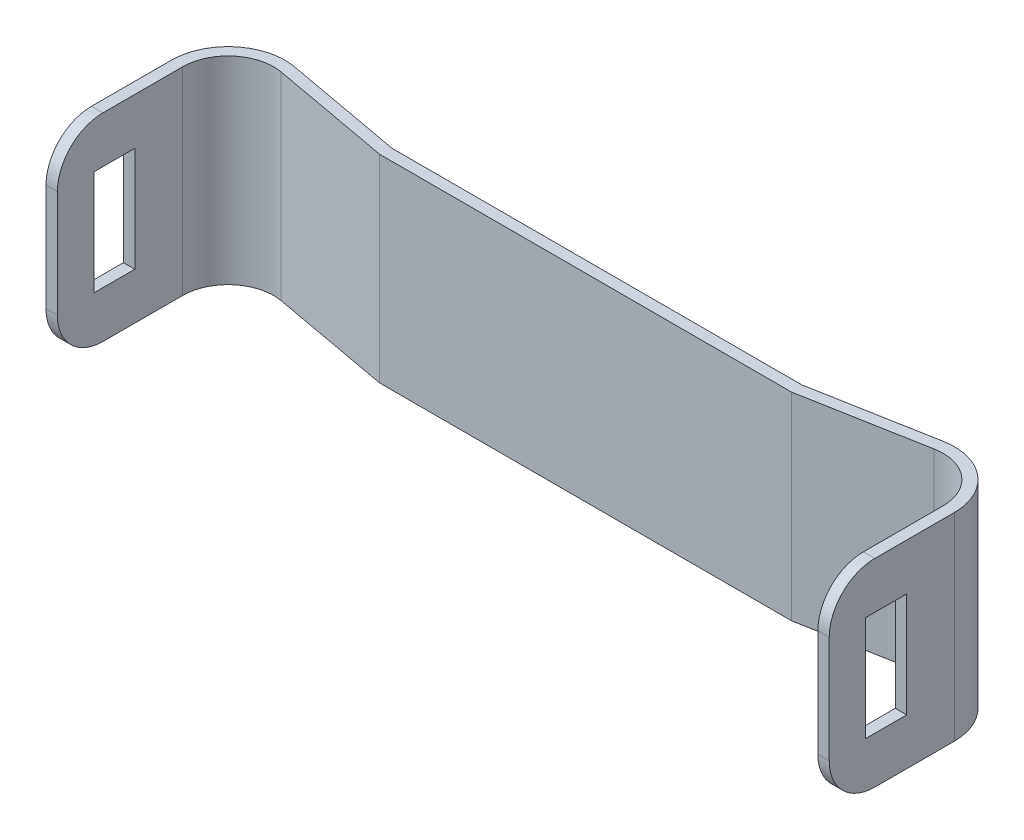
ISO-10303-21;
HEADER;
FILE_DESCRIPTION(('STEP AP214'),'2;1');
FILE_NAME('part.step','',(''),(''),'','','');
FILE_SCHEMA(('AUTOMOTIVE_DESIGN { 1 0 10303 214 1 1 1 1 }'));
ENDSEC;
DATA;
#1=APPLICATION_CONTEXT('core data for automotive mechanical design processes');
#2=APPLICATION_PROTOCOL_DEFINITION('international standard','automotive_design',2000,#1);
#3=PRODUCT_CONTEXT('',#1,'mechanical');
#4=PRODUCT('Part','Part','',(#3));
#5=PRODUCT_RELATED_PRODUCT_CATEGORY('part','',(#4));
#6=PRODUCT_DEFINITION_FORMATION('','',#4);
#7=PRODUCT_DEFINITION_CONTEXT('part definition',#1,'design');
#8=PRODUCT_DEFINITION('design','',#6,#7);
#9=PRODUCT_DEFINITION_SHAPE('','',#8);
#10=(LENGTH_UNIT() NAMED_UNIT(*) SI_UNIT(.MILLI.,.METRE.));
#11=(NAMED_UNIT(*) PLANE_ANGLE_UNIT() SI_UNIT($,.RADIAN.));
#12=(NAMED_UNIT(*) SI_UNIT($,.STERADIAN.) SOLID_ANGLE_UNIT());
#13=UNCERTAINTY_MEASURE_WITH_UNIT(LENGTH_MEASURE(1.E-05),#10,'distance_accuracy_value','');
#14=(GEOMETRIC_REPRESENTATION_CONTEXT(3) GLOBAL_UNCERTAINTY_ASSIGNED_CONTEXT((#13)) GLOBAL_UNIT_ASSIGNED_CONTEXT((#10,
#11,#12)) REPRESENTATION_CONTEXT('',''));
#15=CARTESIAN_POINT('',(0.,0.,0.));
#16=DIRECTION('',(0.,0.,1.));
#17=DIRECTION('',(1.,0.,0.));
#18=AXIS2_PLACEMENT_3D('',#15,#16,#17);
#19=CARTESIAN_POINT('',(-16.7,4.35,7.));
#20=DIRECTION('',(0.,0.,1.));
#21=DIRECTION('',(1.,0.,0.));
#22=AXIS2_PLACEMENT_3D('',#19,#20,#21);
#23=PLANE('',#22);
#24=DIRECTION('',(0.,-1.,0.));
#25=VECTOR('',#24,1.);
#26=CARTESIAN_POINT('',(-16.7,4.35,7.));
#27=LINE('',#26,#25);
#28=CARTESIAN_POINT('',(-16.7,2.35,7.));
#29=VERTEX_POINT('',#28);
#30=CARTESIAN_POINT('',(-16.7,-2.35,7.));
#31=VERTEX_POINT('',#30);
#32=EDGE_CURVE('E346',#29,#31,#27,.T.);
#33=ORIENTED_EDGE('',*,*,#32,.F.);
#34=DIRECTION('',(1.,0.,0.));
#35=VECTOR('',#34,1.);
#36=CARTESIAN_POINT('',(-17.2,2.35,7.));
#37=LINE('',#36,#35);
#38=CARTESIAN_POINT('',(-17.2,2.35,7.));
#39=VERTEX_POINT('',#38);
#40=EDGE_CURVE('E399',#39,#29,#37,.T.);
#41=ORIENTED_EDGE('',*,*,#40,.F.);
#42=DIRECTION('',(0.,-1.,0.));
#43=VECTOR('',#42,1.);
#44=CARTESIAN_POINT('',(-17.2,4.35,7.));
#45=LINE('',#44,#43);
#46=CARTESIAN_POINT('',(-17.2,-2.35,7.));
#47=VERTEX_POINT('',#46);
#48=EDGE_CURVE('E233',#39,#47,#45,.T.);
#49=ORIENTED_EDGE('',*,*,#48,.T.);
#50=DIRECTION('',(1.,0.,0.));
#51=VECTOR('',#50,1.);
#52=CARTESIAN_POINT('',(-17.2,-2.35,7.));
#53=LINE('',#52,#51);
#54=EDGE_CURVE('E569',#47,#31,#53,.T.);
#55=ORIENTED_EDGE('',*,*,#54,.T.);
#56=EDGE_LOOP('',(#33,#41,#49,#55));
#57=FACE_BOUND('',#56,.T.);
#58=ADVANCED_FACE('F33',(#57),#23,.T.);
#59=CARTESIAN_POINT('',(17.2,4.35,7.));
#60=DIRECTION('',(0.,0.,1.));
#61=DIRECTION('',(1.,0.,0.));
#62=AXIS2_PLACEMENT_3D('',#59,#60,#61);
#63=PLANE('',#62);
#64=DIRECTION('',(0.,-1.,0.));
#65=VECTOR('',#64,1.);
#66=CARTESIAN_POINT('',(17.2,4.35,7.));
#67=LINE('',#66,#65);
#68=CARTESIAN_POINT('',(17.2,2.35,7.));
#69=VERTEX_POINT('',#68);
#70=CARTESIAN_POINT('',(17.2,-2.35,7.));
#71=VERTEX_POINT('',#70);
#72=EDGE_CURVE('E327',#69,#71,#67,.T.);
#73=ORIENTED_EDGE('',*,*,#72,.F.);
#74=CARTESIAN_POINT('',(16.7,2.35,7.));
#75=VERTEX_POINT('',#74);
#76=EDGE_CURVE('E568',#75,#69,#37,.T.);
#77=ORIENTED_EDGE('',*,*,#76,.F.);
#78=DIRECTION('',(0.,-1.,0.));
#79=VECTOR('',#78,1.);
#80=CARTESIAN_POINT('',(16.7,4.35,7.));
#81=LINE('',#80,#79);
#82=CARTESIAN_POINT('',(16.7,-2.35,7.));
#83=VERTEX_POINT('',#82);
#84=EDGE_CURVE('E330',#75,#83,#81,.T.);
#85=ORIENTED_EDGE('',*,*,#84,.T.);
#86=EDGE_CURVE('E567',#83,#71,#53,.T.);
#87=ORIENTED_EDGE('',*,*,#86,.T.);
#88=EDGE_LOOP('',(#73,#77,#85,#87));
#89=FACE_BOUND('',#88,.T.);
#90=ADVANCED_FACE('F491',(#89),#63,.T.);
#91=CARTESIAN_POINT('',(-17.2,4.35,1.5));
#92=DIRECTION('',(1.,0.,0.));
#93=DIRECTION('',(0.,0.,-1.));
#94=AXIS2_PLACEMENT_3D('',#91,#92,#93);
#95=PLANE('',#94);
#96=DIRECTION('',(0.,0.,1.));
#97=VECTOR('',#96,1.);
#98=CARTESIAN_POINT('',(-17.2,2.3,5.4));
#99=LINE('',#98,#97);
#100=CARTESIAN_POINT('',(-17.2,2.3,3.6));
#101=VERTEX_POINT('',#100);
#102=CARTESIAN_POINT('',(-17.2,2.3,5.4));
#103=VERTEX_POINT('',#102);
#104=EDGE_CURVE('E414',#101,#103,#99,.T.);
#105=ORIENTED_EDGE('',*,*,#104,.T.);
#106=DIRECTION('',(0.,-1.,0.));
#107=VECTOR('',#106,1.);
#108=CARTESIAN_POINT('',(-17.2,2.3,5.4));
#109=LINE('',#108,#107);
#110=CARTESIAN_POINT('',(-17.2,-2.3,5.4));
#111=VERTEX_POINT('',#110);
#112=EDGE_CURVE('E404',#103,#111,#109,.T.);
#113=ORIENTED_EDGE('',*,*,#112,.T.);
#114=DIRECTION('',(0.,0.,-1.));
#115=VECTOR('',#114,1.);
#116=CARTESIAN_POINT('',(-17.2,-2.3,5.4));
#117=LINE('',#116,#115);
#118=CARTESIAN_POINT('',(-17.2,-2.3,3.6));
#119=VERTEX_POINT('',#118);
#120=EDGE_CURVE('E407',#111,#119,#117,.T.);
#121=ORIENTED_EDGE('',*,*,#120,.T.);
#122=DIRECTION('',(0.,1.,0.));
#123=VECTOR('',#122,1.);
#124=CARTESIAN_POINT('',(-17.2,2.3,3.6));
#125=LINE('',#124,#123);
#126=EDGE_CURVE('E411',#119,#101,#125,.T.);
#127=ORIENTED_EDGE('',*,*,#126,.T.);
#128=EDGE_LOOP('',(#105,#113,#121,#127));
#129=FACE_BOUND('',#128,.T.);
#130=ORIENTED_EDGE('',*,*,#48,.F.);
#131=CARTESIAN_POINT('',(-17.2,2.35,5.));
#132=DIRECTION('',(-1.,0.,0.));
#133=DIRECTION('',(0.,0.,1.));
#134=AXIS2_PLACEMENT_3D('',#131,#132,#133);
#135=CIRCLE('',#134,2.);
#136=CARTESIAN_POINT('',(-17.2,4.35,5.));
#137=VERTEX_POINT('',#136);
#138=EDGE_CURVE('E217',#39,#137,#135,.T.);
#139=ORIENTED_EDGE('',*,*,#138,.T.);
#140=DIRECTION('',(0.,0.,1.));
#141=VECTOR('',#140,1.);
#142=CARTESIAN_POINT('',(-17.2,4.35,1.5));
#143=LINE('',#142,#141);
#144=CARTESIAN_POINT('',(-17.2,4.35,1.5));
#145=VERTEX_POINT('',#144);
#146=EDGE_CURVE('E230',#145,#137,#143,.T.);
#147=ORIENTED_EDGE('',*,*,#146,.F.);
#148=DIRECTION('',(0.,-1.,0.));
#149=VECTOR('',#148,1.);
#150=CARTESIAN_POINT('',(-17.2,4.35,1.5));
#151=LINE('',#150,#149);
#152=CARTESIAN_POINT('',(-17.2,-4.35,1.5));
#153=VERTEX_POINT('',#152);
#154=EDGE_CURVE('E278',#145,#153,#151,.T.);
#155=ORIENTED_EDGE('',*,*,#154,.T.);
#156=DIRECTION('',(0.,0.,1.));
#157=VECTOR('',#156,1.);
#158=CARTESIAN_POINT('',(-17.2,-4.35,1.5));
#159=LINE('',#158,#157);
#160=CARTESIAN_POINT('',(-17.2,-4.35,5.));
#161=VERTEX_POINT('',#160);
#162=EDGE_CURVE('E279',#153,#161,#159,.T.);
#163=ORIENTED_EDGE('',*,*,#162,.T.);
#164=CARTESIAN_POINT('',(-17.2,-2.35,5.));
#165=DIRECTION('',(-1.,0.,0.));
#166=DIRECTION('',(0.,0.,-1.));
#167=AXIS2_PLACEMENT_3D('',#164,#165,#166);
#168=CIRCLE('',#167,2.);
#169=EDGE_CURVE('E224',#161,#47,#168,.T.);
#170=ORIENTED_EDGE('',*,*,#169,.T.);
#171=EDGE_LOOP('',(#130,#139,#147,#155,#163,#170));
#172=FACE_BOUND('',#171,.T.);
#173=ADVANCED_FACE('F35',(#129,#172),#95,.F.);
#174=CARTESIAN_POINT('',(-16.7,4.35,1.5));
#175=DIRECTION('',(1.,0.,0.));
#176=DIRECTION('',(0.,0.,-1.));
#177=AXIS2_PLACEMENT_3D('',#174,#175,#176);
#178=PLANE('',#177);
#179=CARTESIAN_POINT('',(-16.7,2.35,5.));
#180=DIRECTION('',(1.,0.,0.));
#181=DIRECTION('',(0.,0.,-1.));
#182=AXIS2_PLACEMENT_3D('',#179,#180,#181);
#183=CIRCLE('',#182,2.);
#184=CARTESIAN_POINT('',(-16.7,4.35,5.));
#185=VERTEX_POINT('',#184);
#186=EDGE_CURVE('E55',#29,#185,#183,.F.);
#187=ORIENTED_EDGE('',*,*,#186,.F.);
#188=ORIENTED_EDGE('',*,*,#32,.T.);
#189=CARTESIAN_POINT('',(-16.7,-2.35,5.));
#190=DIRECTION('',(1.,0.,0.));
#191=DIRECTION('',(0.,0.,-1.));
#192=AXIS2_PLACEMENT_3D('',#189,#190,#191);
#193=CIRCLE('',#192,2.);
#194=CARTESIAN_POINT('',(-16.7,-4.35,5.));
#195=VERTEX_POINT('',#194);
#196=EDGE_CURVE('E392',#195,#31,#193,.F.);
#197=ORIENTED_EDGE('',*,*,#196,.F.);
#198=DIRECTION('',(0.,0.,1.));
#199=VECTOR('',#198,1.);
#200=CARTESIAN_POINT('',(-16.7,-4.35,1.5));
#201=LINE('',#200,#199);
#202=CARTESIAN_POINT('',(-16.7,-4.35,1.5));
#203=VERTEX_POINT('',#202);
#204=EDGE_CURVE('E282',#203,#195,#201,.T.);
#205=ORIENTED_EDGE('',*,*,#204,.F.);
#206=DIRECTION('',(0.,-1.,0.));
#207=VECTOR('',#206,1.);
#208=CARTESIAN_POINT('',(-16.7,4.35,1.5));
#209=LINE('',#208,#207);
#210=CARTESIAN_POINT('',(-16.7,4.35,1.5));
#211=VERTEX_POINT('',#210);
#212=EDGE_CURVE('E344',#211,#203,#209,.T.);
#213=ORIENTED_EDGE('',*,*,#212,.F.);
#214=DIRECTION('',(0.,0.,1.));
#215=VECTOR('',#214,1.);
#216=CARTESIAN_POINT('',(-16.7,4.35,1.5));
#217=LINE('',#216,#215);
#218=EDGE_CURVE('E240',#211,#185,#217,.T.);
#219=ORIENTED_EDGE('',*,*,#218,.T.);
#220=EDGE_LOOP('',(#187,#188,#197,#205,#213,#219));
#221=FACE_BOUND('',#220,.T.);
#222=DIRECTION('',(0.,-1.,0.));
#223=VECTOR('',#222,1.);
#224=CARTESIAN_POINT('',(-16.7,4.35,5.4));
#225=LINE('',#224,#223);
#226=CARTESIAN_POINT('',(-16.7,2.3,5.4));
#227=VERTEX_POINT('',#226);
#228=CARTESIAN_POINT('',(-16.7,-2.3,5.4));
#229=VERTEX_POINT('',#228);
#230=EDGE_CURVE('E248',#227,#229,#225,.T.);
#231=ORIENTED_EDGE('',*,*,#230,.F.);
#232=DIRECTION('',(0.,0.,1.));
#233=VECTOR('',#232,1.);
#234=CARTESIAN_POINT('',(-16.7,2.3,1.5));
#235=LINE('',#234,#233);
#236=CARTESIAN_POINT('',(-16.7,2.3,3.6));
#237=VERTEX_POINT('',#236);
#238=EDGE_CURVE('E452',#237,#227,#235,.T.);
#239=ORIENTED_EDGE('',*,*,#238,.F.);
#240=DIRECTION('',(0.,1.,0.));
#241=VECTOR('',#240,1.);
#242=CARTESIAN_POINT('',(-16.7,4.35,3.6));
#243=LINE('',#242,#241);
#244=CARTESIAN_POINT('',(-16.7,-2.3,3.6));
#245=VERTEX_POINT('',#244);
#246=EDGE_CURVE('E448',#245,#237,#243,.T.);
#247=ORIENTED_EDGE('',*,*,#246,.F.);
#248=DIRECTION('',(0.,0.,-1.));
#249=VECTOR('',#248,1.);
#250=CARTESIAN_POINT('',(-16.7,-2.3,1.5));
#251=LINE('',#250,#249);
#252=EDGE_CURVE('E443',#229,#245,#251,.T.);
#253=ORIENTED_EDGE('',*,*,#252,.F.);
#254=EDGE_LOOP('',(#231,#239,#247,#253));
#255=FACE_BOUND('',#254,.T.);
#256=ADVANCED_FACE('F390',(#221,#255),#178,.T.);
#257=CARTESIAN_POINT('',(-14.7,4.35,1.5));
#258=DIRECTION('',(0.,-1.,0.));
#259=DIRECTION('',(0.,0.,-1.));
#260=AXIS2_PLACEMENT_3D('',#257,#258,#259);
#261=CYLINDRICAL_SURFACE('',#260,2.);
#262=CARTESIAN_POINT('',(-14.7,-4.35,1.5));
#263=DIRECTION('',(0.,1.,0.));
#264=DIRECTION('',(1.,0.,0.));
#265=AXIS2_PLACEMENT_3D('',#262,#263,#264);
#266=CIRCLE('',#265,2.);
#267=CARTESIAN_POINT('',(-14.3405528892947,-4.35,-0.46743431265332));
#268=VERTEX_POINT('',#267);
#269=EDGE_CURVE('E285',#268,#203,#266,.T.);
#270=ORIENTED_EDGE('',*,*,#269,.F.);
#271=DIRECTION('',(0.,-1.,0.));
#272=VECTOR('',#271,1.);
#273=CARTESIAN_POINT('',(-14.3405528892947,4.35,-0.46743431265332));
#274=LINE('',#273,#272);
#275=CARTESIAN_POINT('',(-14.3405528892947,4.35,-0.46743431265332));
#276=VERTEX_POINT('',#275);
#277=EDGE_CURVE('E342',#276,#268,#274,.T.);
#278=ORIENTED_EDGE('',*,*,#277,.F.);
#279=CARTESIAN_POINT('',(-14.7,4.35,1.5));
#280=DIRECTION('',(0.,1.,0.));
#281=DIRECTION('',(1.,0.,0.));
#282=AXIS2_PLACEMENT_3D('',#279,#280,#281);
#283=CIRCLE('',#282,2.);
#284=EDGE_CURVE('E243',#276,#211,#283,.T.);
#285=ORIENTED_EDGE('',*,*,#284,.T.);
#286=ORIENTED_EDGE('',*,*,#212,.T.);
#287=EDGE_LOOP('',(#270,#278,#285,#286));
#288=FACE_BOUND('',#287,.T.);
#289=ADVANCED_FACE('F386',(#288),#261,.F.);
#290=CARTESIAN_POINT('',(-9.08986177767631,4.35,0.49185857816333));
#291=DIRECTION('',(-0.179723555352633,0.,0.983717156326659));
#292=DIRECTION('',(0.983717156326659,0.,0.179723555352634));
#293=AXIS2_PLACEMENT_3D('',#290,#291,#292);
#294=PLANE('',#293);
#295=DIRECTION('',(-0.983717156326659,0.,-0.179723555352634));
#296=VECTOR('',#295,1.);
#297=CARTESIAN_POINT('',(-9.08986177767631,-4.35,0.49185857816333));
#298=LINE('',#297,#296);
#299=CARTESIAN_POINT('',(-9.04529969274587,-4.35,0.5));
#300=VERTEX_POINT('',#299);
#301=EDGE_CURVE('E288',#300,#268,#298,.T.);
#302=ORIENTED_EDGE('',*,*,#301,.F.);
#303=DIRECTION('',(0.,-1.,0.));
#304=VECTOR('',#303,1.);
#305=CARTESIAN_POINT('',(-9.04529969274587,4.35,0.5));
#306=LINE('',#305,#304);
#307=CARTESIAN_POINT('',(-9.04529969274587,4.35,0.5));
#308=VERTEX_POINT('',#307);
#309=EDGE_CURVE('E340',#308,#300,#306,.T.);
#310=ORIENTED_EDGE('',*,*,#309,.F.);
#311=DIRECTION('',(-0.983717156326659,0.,-0.179723555352634));
#312=VECTOR('',#311,1.);
#313=CARTESIAN_POINT('',(-9.08986177767631,4.35,0.49185857816333));
#314=LINE('',#313,#312);
#315=EDGE_CURVE('E253',#308,#276,#314,.T.);
#316=ORIENTED_EDGE('',*,*,#315,.T.);
#317=ORIENTED_EDGE('',*,*,#277,.T.);
#318=EDGE_LOOP('',(#302,#310,#316,#317));
#319=FACE_BOUND('',#318,.T.);
#320=ADVANCED_FACE('F381',(#319),#294,.T.);
#321=CARTESIAN_POINT('',(-9.,4.35,0.5));
#322=DIRECTION('',(0.,0.,1.));
#323=DIRECTION('',(1.,0.,0.));
#324=AXIS2_PLACEMENT_3D('',#321,#322,#323);
#325=PLANE('',#324);
#326=DIRECTION('',(-1.,0.,0.));
#327=VECTOR('',#326,1.);
#328=CARTESIAN_POINT('',(-9.,-4.35,0.5));
#329=LINE('',#328,#327);
#330=CARTESIAN_POINT('',(9.04529969274587,-4.35,0.499999999999998));
#331=VERTEX_POINT('',#330);
#332=EDGE_CURVE('E291',#331,#300,#329,.T.);
#333=ORIENTED_EDGE('',*,*,#332,.F.);
#334=DIRECTION('',(0.,-1.,0.));
#335=VECTOR('',#334,1.);
#336=CARTESIAN_POINT('',(9.04529969274587,4.35,0.499999999999998));
#337=LINE('',#336,#335);
#338=CARTESIAN_POINT('',(9.04529969274587,4.35,0.499999999999998));
#339=VERTEX_POINT('',#338);
#340=EDGE_CURVE('E338',#339,#331,#337,.T.);
#341=ORIENTED_EDGE('',*,*,#340,.F.);
#342=DIRECTION('',(-1.,0.,0.));
#343=VECTOR('',#342,1.);
#344=CARTESIAN_POINT('',(-9.,4.35,0.5));
#345=LINE('',#344,#343);
#346=EDGE_CURVE('E256',#339,#308,#345,.T.);
#347=ORIENTED_EDGE('',*,*,#346,.T.);
#348=ORIENTED_EDGE('',*,*,#309,.T.);
#349=EDGE_LOOP('',(#333,#341,#347,#348));
#350=FACE_BOUND('',#349,.T.);
#351=ADVANCED_FACE('F377',(#350),#325,.T.);
#352=CARTESIAN_POINT('',(9.08986177767632,4.35,0.491858578163328));
#353=DIRECTION('',(0.179723555352634,0.,0.983717156326659));
#354=DIRECTION('',(0.983717156326659,0.,-0.179723555352634));
#355=AXIS2_PLACEMENT_3D('',#352,#353,#354);
#356=PLANE('',#355);
#357=DIRECTION('',(-0.983717156326659,0.,0.179723555352634));
#358=VECTOR('',#357,1.);
#359=CARTESIAN_POINT('',(9.08986177767632,-4.35,0.491858578163328));
#360=LINE('',#359,#358);
#361=CARTESIAN_POINT('',(14.3405528892947,-4.35,-0.467434312653321));
#362=VERTEX_POINT('',#361);
#363=EDGE_CURVE('E294',#362,#331,#360,.T.);
#364=ORIENTED_EDGE('',*,*,#363,.F.);
#365=DIRECTION('',(0.,-1.,0.));
#366=VECTOR('',#365,1.);
#367=CARTESIAN_POINT('',(14.3405528892947,4.35,-0.467434312653321));
#368=LINE('',#367,#366);
#369=CARTESIAN_POINT('',(14.3405528892947,4.35,-0.467434312653321));
#370=VERTEX_POINT('',#369);
#371=EDGE_CURVE('E336',#370,#362,#368,.T.);
#372=ORIENTED_EDGE('',*,*,#371,.F.);
#373=DIRECTION('',(-0.983717156326659,0.,0.179723555352634));
#374=VECTOR('',#373,1.);
#375=CARTESIAN_POINT('',(9.08986177767632,4.35,0.491858578163328));
#376=LINE('',#375,#374);
#377=EDGE_CURVE('E259',#370,#339,#376,.T.);
#378=ORIENTED_EDGE('',*,*,#377,.T.);
#379=ORIENTED_EDGE('',*,*,#340,.T.);
#380=EDGE_LOOP('',(#364,#372,#378,#379));
#381=FACE_BOUND('',#380,.T.);
#382=ADVANCED_FACE('F373',(#381),#356,.T.);
#383=CARTESIAN_POINT('',(14.7,4.35,1.5));
#384=DIRECTION('',(0.,-1.,0.));
#385=DIRECTION('',(0.,0.,-1.));
#386=AXIS2_PLACEMENT_3D('',#383,#384,#385);
#387=CYLINDRICAL_SURFACE('',#386,2.);
#388=CARTESIAN_POINT('',(14.7,-4.35,1.5));
#389=DIRECTION('',(0.,1.,0.));
#390=DIRECTION('',(1.,0.,0.));
#391=AXIS2_PLACEMENT_3D('',#388,#389,#390);
#392=CIRCLE('',#391,2.);
#393=CARTESIAN_POINT('',(16.7,-4.35,1.5));
#394=VERTEX_POINT('',#393);
#395=EDGE_CURVE('E297',#394,#362,#392,.T.);
#396=ORIENTED_EDGE('',*,*,#395,.F.);
#397=DIRECTION('',(0.,-1.,0.));
#398=VECTOR('',#397,1.);
#399=CARTESIAN_POINT('',(16.7,4.35,1.5));
#400=LINE('',#399,#398);
#401=CARTESIAN_POINT('',(16.7,4.35,1.5));
#402=VERTEX_POINT('',#401);
#403=EDGE_CURVE('E333',#402,#394,#400,.T.);
#404=ORIENTED_EDGE('',*,*,#403,.F.);
#405=CARTESIAN_POINT('',(14.7,4.35,1.5));
#406=DIRECTION('',(0.,1.,0.));
#407=DIRECTION('',(1.,0.,0.));
#408=AXIS2_PLACEMENT_3D('',#405,#406,#407);
#409=CIRCLE('',#408,2.);
#410=EDGE_CURVE('E262',#402,#370,#409,.T.);
#411=ORIENTED_EDGE('',*,*,#410,.T.);
#412=ORIENTED_EDGE('',*,*,#371,.T.);
#413=EDGE_LOOP('',(#396,#404,#411,#412));
#414=FACE_BOUND('',#413,.T.);
#415=ADVANCED_FACE('F369',(#414),#387,.F.);
#416=CARTESIAN_POINT('',(16.7,4.35,1.5));
#417=DIRECTION('',(-1.,0.,0.));
#418=DIRECTION('',(0.,0.,1.));
#419=AXIS2_PLACEMENT_3D('',#416,#417,#418);
#420=PLANE('',#419);
#421=CARTESIAN_POINT('',(16.7,2.35,5.));
#422=DIRECTION('',(-1.,0.,0.));
#423=DIRECTION('',(0.,0.,1.));
#424=AXIS2_PLACEMENT_3D('',#421,#422,#423);
#425=CIRCLE('',#424,2.);
#426=CARTESIAN_POINT('',(16.7,4.35,5.));
#427=VERTEX_POINT('',#426);
#428=EDGE_CURVE('E396',#427,#75,#425,.F.);
#429=ORIENTED_EDGE('',*,*,#428,.F.);
#430=DIRECTION('',(0.,0.,-1.));
#431=VECTOR('',#430,1.);
#432=CARTESIAN_POINT('',(16.7,4.35,1.5));
#433=LINE('',#432,#431);
#434=EDGE_CURVE('E265',#427,#402,#433,.T.);
#435=ORIENTED_EDGE('',*,*,#434,.T.);
#436=ORIENTED_EDGE('',*,*,#403,.T.);
#437=DIRECTION('',(0.,0.,-1.));
#438=VECTOR('',#437,1.);
#439=CARTESIAN_POINT('',(16.7,-4.35,1.5));
#440=LINE('',#439,#438);
#441=CARTESIAN_POINT('',(16.7,-4.35,5.));
#442=VERTEX_POINT('',#441);
#443=EDGE_CURVE('E300',#442,#394,#440,.T.);
#444=ORIENTED_EDGE('',*,*,#443,.F.);
#445=CARTESIAN_POINT('',(16.7,-2.35,5.));
#446=DIRECTION('',(-1.,0.,0.));
#447=DIRECTION('',(0.,0.,1.));
#448=AXIS2_PLACEMENT_3D('',#445,#446,#447);
#449=CIRCLE('',#448,2.);
#450=EDGE_CURVE('E363',#83,#442,#449,.F.);
#451=ORIENTED_EDGE('',*,*,#450,.F.);
#452=ORIENTED_EDGE('',*,*,#84,.F.);
#453=EDGE_LOOP('',(#429,#435,#436,#444,#451,#452));
#454=FACE_BOUND('',#453,.T.);
#455=DIRECTION('',(0.,1.,0.));
#456=VECTOR('',#455,1.);
#457=CARTESIAN_POINT('',(16.7,4.35,5.4));
#458=LINE('',#457,#456);
#459=CARTESIAN_POINT('',(16.7,-2.3,5.4));
#460=VERTEX_POINT('',#459);
#461=CARTESIAN_POINT('',(16.7,2.3,5.4));
#462=VERTEX_POINT('',#461);
#463=EDGE_CURVE('E453',#460,#462,#458,.T.);
#464=ORIENTED_EDGE('',*,*,#463,.F.);
#465=DIRECTION('',(0.,0.,1.));
#466=VECTOR('',#465,1.);
#467=CARTESIAN_POINT('',(16.7,-2.3,1.5));
#468=LINE('',#467,#466);
#469=CARTESIAN_POINT('',(16.7,-2.3,3.6));
#470=VERTEX_POINT('',#469);
#471=EDGE_CURVE('E430',#470,#460,#468,.T.);
#472=ORIENTED_EDGE('',*,*,#471,.F.);
#473=DIRECTION('',(0.,-1.,0.));
#474=VECTOR('',#473,1.);
#475=CARTESIAN_POINT('',(16.7,4.35,3.6));
#476=LINE('',#475,#474);
#477=CARTESIAN_POINT('',(16.7,2.3,3.6));
#478=VERTEX_POINT('',#477);
#479=EDGE_CURVE('E445',#478,#470,#476,.T.);
#480=ORIENTED_EDGE('',*,*,#479,.F.);
#481=DIRECTION('',(0.,0.,-1.));
#482=VECTOR('',#481,1.);
#483=CARTESIAN_POINT('',(16.7,2.3,1.5));
#484=LINE('',#483,#482);
#485=EDGE_CURVE('E450',#462,#478,#484,.T.);
#486=ORIENTED_EDGE('',*,*,#485,.F.);
#487=EDGE_LOOP('',(#464,#472,#480,#486));
#488=FACE_BOUND('',#487,.T.);
#489=ADVANCED_FACE('F360',(#454,#488),#420,.T.);
#490=CARTESIAN_POINT('',(17.2,4.35,1.5));
#491=DIRECTION('',(-1.,0.,0.));
#492=DIRECTION('',(0.,0.,1.));
#493=AXIS2_PLACEMENT_3D('',#490,#491,#492);
#494=PLANE('',#493);
#495=DIRECTION('',(0.,0.,-1.));
#496=VECTOR('',#495,1.);
#497=CARTESIAN_POINT('',(17.2,-2.3,5.4));
#498=LINE('',#497,#496);
#499=CARTESIAN_POINT('',(17.2,-2.3,5.4));
#500=VERTEX_POINT('',#499);
#501=CARTESIAN_POINT('',(17.2,-2.3,3.6));
#502=VERTEX_POINT('',#501);
#503=EDGE_CURVE('E419',#500,#502,#498,.T.);
#504=ORIENTED_EDGE('',*,*,#503,.F.);
#505=DIRECTION('',(0.,-1.,0.));
#506=VECTOR('',#505,1.);
#507=CARTESIAN_POINT('',(17.2,2.3,5.4));
#508=LINE('',#507,#506);
#509=CARTESIAN_POINT('',(17.2,2.3,5.4));
#510=VERTEX_POINT('',#509);
#511=EDGE_CURVE('E403',#510,#500,#508,.T.);
#512=ORIENTED_EDGE('',*,*,#511,.F.);
#513=DIRECTION('',(0.,0.,1.));
#514=VECTOR('',#513,1.);
#515=CARTESIAN_POINT('',(17.2,2.3,5.4));
#516=LINE('',#515,#514);
#517=CARTESIAN_POINT('',(17.2,2.3,3.6));
#518=VERTEX_POINT('',#517);
#519=EDGE_CURVE('E408',#518,#510,#516,.T.);
#520=ORIENTED_EDGE('',*,*,#519,.F.);
#521=DIRECTION('',(0.,1.,0.));
#522=VECTOR('',#521,1.);
#523=CARTESIAN_POINT('',(17.2,2.3,3.6));
#524=LINE('',#523,#522);
#525=EDGE_CURVE('E422',#502,#518,#524,.T.);
#526=ORIENTED_EDGE('',*,*,#525,.F.);
#527=EDGE_LOOP('',(#504,#512,#520,#526));
#528=FACE_BOUND('',#527,.T.);
#529=DIRECTION('',(0.,0.,-1.));
#530=VECTOR('',#529,1.);
#531=CARTESIAN_POINT('',(17.2,4.35,1.5));
#532=LINE('',#531,#530);
#533=CARTESIAN_POINT('',(17.2,4.35,5.));
#534=VERTEX_POINT('',#533);
#535=CARTESIAN_POINT('',(17.2,4.35,1.5));
#536=VERTEX_POINT('',#535);
#537=EDGE_CURVE('E267',#534,#536,#532,.T.);
#538=ORIENTED_EDGE('',*,*,#537,.F.);
#539=CARTESIAN_POINT('',(17.2,2.35,5.));
#540=DIRECTION('',(-1.,0.,0.));
#541=DIRECTION('',(0.,0.,1.));
#542=AXIS2_PLACEMENT_3D('',#539,#540,#541);
#543=CIRCLE('',#542,2.);
#544=EDGE_CURVE('E47',#69,#534,#543,.T.);
#545=ORIENTED_EDGE('',*,*,#544,.F.);
#546=ORIENTED_EDGE('',*,*,#72,.T.);
#547=CARTESIAN_POINT('',(17.2,-2.35,5.));
#548=DIRECTION('',(-1.,0.,0.));
#549=DIRECTION('',(0.,0.,-1.));
#550=AXIS2_PLACEMENT_3D('',#547,#548,#549);
#551=CIRCLE('',#550,2.);
#552=CARTESIAN_POINT('',(17.2,-4.35,5.));
#553=VERTEX_POINT('',#552);
#554=EDGE_CURVE('E234',#553,#71,#551,.T.);
#555=ORIENTED_EDGE('',*,*,#554,.F.);
#556=DIRECTION('',(0.,0.,-1.));
#557=VECTOR('',#556,1.);
#558=CARTESIAN_POINT('',(17.2,-4.35,1.5));
#559=LINE('',#558,#557);
#560=CARTESIAN_POINT('',(17.2,-4.35,1.5));
#561=VERTEX_POINT('',#560);
#562=EDGE_CURVE('E302',#553,#561,#559,.T.);
#563=ORIENTED_EDGE('',*,*,#562,.T.);
#564=DIRECTION('',(0.,-1.,0.));
#565=VECTOR('',#564,1.);
#566=CARTESIAN_POINT('',(17.2,4.35,1.5));
#567=LINE('',#566,#565);
#568=EDGE_CURVE('E324',#536,#561,#567,.T.);
#569=ORIENTED_EDGE('',*,*,#568,.F.);
#570=EDGE_LOOP('',(#538,#545,#546,#555,#563,#569));
#571=FACE_BOUND('',#570,.T.);
#572=ADVANCED_FACE('F512',(#528,#571),#494,.F.);
#573=CARTESIAN_POINT('',(14.7,4.35,1.5));
#574=DIRECTION('',(0.,-1.,0.));
#575=DIRECTION('',(0.,0.,-1.));
#576=AXIS2_PLACEMENT_3D('',#573,#574,#575);
#577=CYLINDRICAL_SURFACE('',#576,2.5);
#578=CARTESIAN_POINT('',(14.7,-4.35,1.5));
#579=DIRECTION('',(0.,1.,0.));
#580=DIRECTION('',(0.,0.,-1.));
#581=AXIS2_PLACEMENT_3D('',#578,#579,#580);
#582=CIRCLE('',#581,2.5);
#583=CARTESIAN_POINT('',(14.2506911116184,-4.35,-0.959292890816651));
#584=VERTEX_POINT('',#583);
#585=EDGE_CURVE('E304',#561,#584,#582,.T.);
#586=ORIENTED_EDGE('',*,*,#585,.T.);
#587=DIRECTION('',(0.,-1.,0.));
#588=VECTOR('',#587,1.);
#589=CARTESIAN_POINT('',(14.2506911116184,4.35,-0.959292890816651));
#590=LINE('',#589,#588);
#591=CARTESIAN_POINT('',(14.2506911116184,4.35,-0.959292890816651));
#592=VERTEX_POINT('',#591);
#593=EDGE_CURVE('E321',#592,#584,#590,.T.);
#594=ORIENTED_EDGE('',*,*,#593,.F.);
#595=CARTESIAN_POINT('',(14.7,4.35,1.5));
#596=DIRECTION('',(0.,1.,0.));
#597=DIRECTION('',(0.,0.,-1.));
#598=AXIS2_PLACEMENT_3D('',#595,#596,#597);
#599=CIRCLE('',#598,2.5);
#600=EDGE_CURVE('E269',#536,#592,#599,.T.);
#601=ORIENTED_EDGE('',*,*,#600,.F.);
#602=ORIENTED_EDGE('',*,*,#568,.T.);
#603=EDGE_LOOP('',(#586,#594,#601,#602));
#604=FACE_BOUND('',#603,.T.);
#605=ADVANCED_FACE('F516',(#604),#577,.T.);
#606=CARTESIAN_POINT('',(9.,4.35,0.));
#607=DIRECTION('',(0.179723555352634,0.,0.983717156326659));
#608=DIRECTION('',(0.983717156326659,0.,-0.179723555352634));
#609=AXIS2_PLACEMENT_3D('',#606,#607,#608);
#610=PLANE('',#609);
#611=DIRECTION('',(-0.983717156326659,0.,0.179723555352634));
#612=VECTOR('',#611,1.);
#613=CARTESIAN_POINT('',(9.,-4.35,0.));
#614=LINE('',#613,#612);
#615=CARTESIAN_POINT('',(9.,-4.35,0.));
#616=VERTEX_POINT('',#615);
#617=EDGE_CURVE('E306',#584,#616,#614,.T.);
#618=ORIENTED_EDGE('',*,*,#617,.T.);
#619=DIRECTION('',(0.,-1.,0.));
#620=VECTOR('',#619,1.);
#621=CARTESIAN_POINT('',(9.,4.35,0.));
#622=LINE('',#621,#620);
#623=CARTESIAN_POINT('',(9.,4.35,0.));
#624=VERTEX_POINT('',#623);
#625=EDGE_CURVE('E318',#624,#616,#622,.T.);
#626=ORIENTED_EDGE('',*,*,#625,.F.);
#627=DIRECTION('',(-0.983717156326659,0.,0.179723555352634));
#628=VECTOR('',#627,1.);
#629=CARTESIAN_POINT('',(9.,4.35,0.));
#630=LINE('',#629,#628);
#631=EDGE_CURVE('E271',#592,#624,#630,.T.);
#632=ORIENTED_EDGE('',*,*,#631,.F.);
#633=ORIENTED_EDGE('',*,*,#593,.T.);
#634=EDGE_LOOP('',(#618,#626,#632,#633));
#635=FACE_BOUND('',#634,.T.);
#636=ADVANCED_FACE('F520',(#635),#610,.F.);
#637=CARTESIAN_POINT('',(-9.,4.35,0.));
#638=DIRECTION('',(0.,0.,1.));
#639=DIRECTION('',(1.,0.,0.));
#640=AXIS2_PLACEMENT_3D('',#637,#638,#639);
#641=PLANE('',#640);
#642=DIRECTION('',(-1.,0.,0.));
#643=VECTOR('',#642,1.);
#644=CARTESIAN_POINT('',(-9.,-4.35,0.));
#645=LINE('',#644,#643);
#646=CARTESIAN_POINT('',(-9.,-4.35,0.));
#647=VERTEX_POINT('',#646);
#648=EDGE_CURVE('E308',#616,#647,#645,.T.);
#649=ORIENTED_EDGE('',*,*,#648,.T.);
#650=DIRECTION('',(0.,-1.,0.));
#651=VECTOR('',#650,1.);
#652=CARTESIAN_POINT('',(-9.,4.35,0.));
#653=LINE('',#652,#651);
#654=CARTESIAN_POINT('',(-9.,4.35,0.));
#655=VERTEX_POINT('',#654);
#656=EDGE_CURVE('E315',#655,#647,#653,.T.);
#657=ORIENTED_EDGE('',*,*,#656,.F.);
#658=DIRECTION('',(-1.,0.,0.));
#659=VECTOR('',#658,1.);
#660=CARTESIAN_POINT('',(-9.,4.35,0.));
#661=LINE('',#660,#659);
#662=EDGE_CURVE('E273',#624,#655,#661,.T.);
#663=ORIENTED_EDGE('',*,*,#662,.F.);
#664=ORIENTED_EDGE('',*,*,#625,.T.);
#665=EDGE_LOOP('',(#649,#657,#663,#664));
#666=FACE_BOUND('',#665,.T.);
#667=ADVANCED_FACE('F524',(#666),#641,.F.);
#668=CARTESIAN_POINT('',(-9.,4.35,0.));
#669=DIRECTION('',(-0.179723555352634,0.,0.983717156326659));
#670=DIRECTION('',(0.983717156326659,0.,0.179723555352634));
#671=AXIS2_PLACEMENT_3D('',#668,#669,#670);
#672=PLANE('',#671);
#673=DIRECTION('',(-0.983717156326659,0.,-0.179723555352634));
#674=VECTOR('',#673,1.);
#675=CARTESIAN_POINT('',(-9.,-4.35,0.));
#676=LINE('',#675,#674);
#677=CARTESIAN_POINT('',(-14.2506911116184,-4.35,-0.959292890816648));
#678=VERTEX_POINT('',#677);
#679=EDGE_CURVE('E245',#647,#678,#676,.T.);
#680=ORIENTED_EDGE('',*,*,#679,.T.);
#681=DIRECTION('',(0.,-1.,0.));
#682=VECTOR('',#681,1.);
#683=CARTESIAN_POINT('',(-14.2506911116184,4.35,-0.959292890816648));
#684=LINE('',#683,#682);
#685=CARTESIAN_POINT('',(-14.2506911116184,4.35,-0.959292890816648));
#686=VERTEX_POINT('',#685);
#687=EDGE_CURVE('E312',#686,#678,#684,.T.);
#688=ORIENTED_EDGE('',*,*,#687,.F.);
#689=DIRECTION('',(-0.983717156326659,0.,-0.179723555352634));
#690=VECTOR('',#689,1.);
#691=CARTESIAN_POINT('',(-9.,4.35,0.));
#692=LINE('',#691,#690);
#693=EDGE_CURVE('E275',#655,#686,#692,.T.);
#694=ORIENTED_EDGE('',*,*,#693,.F.);
#695=ORIENTED_EDGE('',*,*,#656,.T.);
#696=EDGE_LOOP('',(#680,#688,#694,#695));
#697=FACE_BOUND('',#696,.T.);
#698=ADVANCED_FACE('F528',(#697),#672,.F.);
#699=CARTESIAN_POINT('',(-14.7,4.35,1.5));
#700=DIRECTION('',(0.,-1.,0.));
#701=DIRECTION('',(0.,0.,-1.));
#702=AXIS2_PLACEMENT_3D('',#699,#700,#701);
#703=CYLINDRICAL_SURFACE('',#702,2.5);
#704=CARTESIAN_POINT('',(-14.7,-4.35,1.5));
#705=DIRECTION('',(0.,1.,0.));
#706=DIRECTION('',(0.,0.,1.));
#707=AXIS2_PLACEMENT_3D('',#704,#705,#706);
#708=CIRCLE('',#707,2.5);
#709=EDGE_CURVE('E241',#678,#153,#708,.T.);
#710=ORIENTED_EDGE('',*,*,#709,.T.);
#711=ORIENTED_EDGE('',*,*,#154,.F.);
#712=CARTESIAN_POINT('',(-14.7,4.35,1.5));
#713=DIRECTION('',(0.,1.,0.));
#714=DIRECTION('',(0.,0.,1.));
#715=AXIS2_PLACEMENT_3D('',#712,#713,#714);
#716=CIRCLE('',#715,2.5);
#717=EDGE_CURVE('E238',#686,#145,#716,.T.);
#718=ORIENTED_EDGE('',*,*,#717,.F.);
#719=ORIENTED_EDGE('',*,*,#687,.T.);
#720=EDGE_LOOP('',(#710,#711,#718,#719));
#721=FACE_BOUND('',#720,.T.);
#722=ADVANCED_FACE('F532',(#721),#703,.T.);
#723=CARTESIAN_POINT('',(-14.7,4.35,1.5));
#724=DIRECTION('',(0.,1.,0.));
#725=DIRECTION('',(1.,0.,0.));
#726=AXIS2_PLACEMENT_3D('',#723,#724,#725);
#727=PLANE('',#726);
#728=DIRECTION('',(-1.,0.,0.));
#729=VECTOR('',#728,1.);
#730=CARTESIAN_POINT('',(-14.7,4.35,5.));
#731=LINE('',#730,#729);
#732=EDGE_CURVE('E11',#534,#427,#731,.T.);
#733=ORIENTED_EDGE('',*,*,#732,.F.);
#734=ORIENTED_EDGE('',*,*,#537,.T.);
#735=ORIENTED_EDGE('',*,*,#600,.T.);
#736=ORIENTED_EDGE('',*,*,#631,.T.);
#737=ORIENTED_EDGE('',*,*,#662,.T.);
#738=ORIENTED_EDGE('',*,*,#693,.T.);
#739=ORIENTED_EDGE('',*,*,#717,.T.);
#740=ORIENTED_EDGE('',*,*,#146,.T.);
#741=DIRECTION('',(1.,0.,0.));
#742=VECTOR('',#741,1.);
#743=CARTESIAN_POINT('',(-17.2,4.35,5.));
#744=LINE('',#743,#742);
#745=EDGE_CURVE('E214',#137,#185,#744,.T.);
#746=ORIENTED_EDGE('',*,*,#745,.T.);
#747=ORIENTED_EDGE('',*,*,#218,.F.);
#748=ORIENTED_EDGE('',*,*,#284,.F.);
#749=ORIENTED_EDGE('',*,*,#315,.F.);
#750=ORIENTED_EDGE('',*,*,#346,.F.);
#751=ORIENTED_EDGE('',*,*,#377,.F.);
#752=ORIENTED_EDGE('',*,*,#410,.F.);
#753=ORIENTED_EDGE('',*,*,#434,.F.);
#754=EDGE_LOOP('',(#733,#734,#735,#736,#737,#738,#739,#740,#746,#747,#748,#749,#750,#751,#752,#753));
#755=FACE_BOUND('',#754,.T.);
#756=ADVANCED_FACE('F236',(#755),#727,.T.);
#757=CARTESIAN_POINT('',(-14.7,-4.35,1.5));
#758=DIRECTION('',(0.,1.,0.));
#759=DIRECTION('',(1.,0.,0.));
#760=AXIS2_PLACEMENT_3D('',#757,#758,#759);
#761=PLANE('',#760);
#762=ORIENTED_EDGE('',*,*,#562,.F.);
#763=DIRECTION('',(-1.,0.,0.));
#764=VECTOR('',#763,1.);
#765=CARTESIAN_POINT('',(-14.7,-4.35,5.));
#766=LINE('',#765,#764);
#767=EDGE_CURVE('E41',#553,#442,#766,.T.);
#768=ORIENTED_EDGE('',*,*,#767,.T.);
#769=ORIENTED_EDGE('',*,*,#443,.T.);
#770=ORIENTED_EDGE('',*,*,#395,.T.);
#771=ORIENTED_EDGE('',*,*,#363,.T.);
#772=ORIENTED_EDGE('',*,*,#332,.T.);
#773=ORIENTED_EDGE('',*,*,#301,.T.);
#774=ORIENTED_EDGE('',*,*,#269,.T.);
#775=ORIENTED_EDGE('',*,*,#204,.T.);
#776=DIRECTION('',(1.,0.,0.));
#777=VECTOR('',#776,1.);
#778=CARTESIAN_POINT('',(-17.2,-4.35,5.));
#779=LINE('',#778,#777);
#780=EDGE_CURVE('E223',#161,#195,#779,.T.);
#781=ORIENTED_EDGE('',*,*,#780,.F.);
#782=ORIENTED_EDGE('',*,*,#162,.F.);
#783=ORIENTED_EDGE('',*,*,#709,.F.);
#784=ORIENTED_EDGE('',*,*,#679,.F.);
#785=ORIENTED_EDGE('',*,*,#648,.F.);
#786=ORIENTED_EDGE('',*,*,#617,.F.);
#787=ORIENTED_EDGE('',*,*,#585,.F.);
#788=EDGE_LOOP('',(#762,#768,#769,#770,#771,#772,#773,#774,#775,#781,#782,#783,#784,#785,#786,#787));
#789=FACE_BOUND('',#788,.T.);
#790=ADVANCED_FACE('F353',(#789),#761,.F.);
#791=CARTESIAN_POINT('',(-17.2,-2.3,5.4));
#792=DIRECTION('',(0.,-1.,0.));
#793=DIRECTION('',(0.,0.,-1.));
#794=AXIS2_PLACEMENT_3D('',#791,#792,#793);
#795=PLANE('',#794);
#796=ORIENTED_EDGE('',*,*,#471,.T.);
#797=DIRECTION('',(1.,0.,0.));
#798=VECTOR('',#797,1.);
#799=CARTESIAN_POINT('',(-17.2,-2.3,5.4));
#800=LINE('',#799,#798);
#801=EDGE_CURVE('E417',#460,#500,#800,.T.);
#802=ORIENTED_EDGE('',*,*,#801,.T.);
#803=ORIENTED_EDGE('',*,*,#503,.T.);
#804=DIRECTION('',(1.,0.,0.));
#805=VECTOR('',#804,1.);
#806=CARTESIAN_POINT('',(-17.2,-2.3,3.6));
#807=LINE('',#806,#805);
#808=EDGE_CURVE('E439',#470,#502,#807,.T.);
#809=ORIENTED_EDGE('',*,*,#808,.F.);
#810=EDGE_LOOP('',(#796,#802,#803,#809));
#811=FACE_BOUND('',#810,.T.);
#812=ADVANCED_FACE('F539',(#811),#795,.F.);
#813=CARTESIAN_POINT('',(-17.2,2.3,3.6));
#814=DIRECTION('',(0.,0.,-1.));
#815=DIRECTION('',(-1.,0.,0.));
#816=AXIS2_PLACEMENT_3D('',#813,#814,#815);
#817=PLANE('',#816);
#818=ORIENTED_EDGE('',*,*,#479,.T.);
#819=ORIENTED_EDGE('',*,*,#808,.T.);
#820=ORIENTED_EDGE('',*,*,#525,.T.);
#821=DIRECTION('',(1.,0.,0.));
#822=VECTOR('',#821,1.);
#823=CARTESIAN_POINT('',(-17.2,2.3,3.6));
#824=LINE('',#823,#822);
#825=EDGE_CURVE('E435',#478,#518,#824,.T.);
#826=ORIENTED_EDGE('',*,*,#825,.F.);
#827=EDGE_LOOP('',(#818,#819,#820,#826));
#828=FACE_BOUND('',#827,.T.);
#829=ADVANCED_FACE('F484',(#828),#817,.F.);
#830=CARTESIAN_POINT('',(-17.2,2.3,5.4));
#831=DIRECTION('',(0.,1.,0.));
#832=DIRECTION('',(0.,0.,1.));
#833=AXIS2_PLACEMENT_3D('',#830,#831,#832);
#834=PLANE('',#833);
#835=ORIENTED_EDGE('',*,*,#485,.T.);
#836=ORIENTED_EDGE('',*,*,#825,.T.);
#837=ORIENTED_EDGE('',*,*,#519,.T.);
#838=DIRECTION('',(1.,0.,0.));
#839=VECTOR('',#838,1.);
#840=CARTESIAN_POINT('',(-17.2,2.3,5.4));
#841=LINE('',#840,#839);
#842=EDGE_CURVE('E431',#462,#510,#841,.T.);
#843=ORIENTED_EDGE('',*,*,#842,.F.);
#844=EDGE_LOOP('',(#835,#836,#837,#843));
#845=FACE_BOUND('',#844,.T.);
#846=ADVANCED_FACE('F478',(#845),#834,.F.);
#847=CARTESIAN_POINT('',(-17.2,2.3,5.4));
#848=DIRECTION('',(0.,0.,1.));
#849=DIRECTION('',(1.,0.,0.));
#850=AXIS2_PLACEMENT_3D('',#847,#848,#849);
#851=PLANE('',#850);
#852=ORIENTED_EDGE('',*,*,#463,.T.);
#853=ORIENTED_EDGE('',*,*,#842,.T.);
#854=ORIENTED_EDGE('',*,*,#511,.T.);
#855=ORIENTED_EDGE('',*,*,#801,.F.);
#856=EDGE_LOOP('',(#852,#853,#854,#855));
#857=FACE_BOUND('',#856,.T.);
#858=ADVANCED_FACE('F485',(#857),#851,.F.);
#859=ORIENTED_EDGE('',*,*,#230,.T.);
#860=EDGE_CURVE('E440',#111,#229,#800,.T.);
#861=ORIENTED_EDGE('',*,*,#860,.F.);
#862=ORIENTED_EDGE('',*,*,#112,.F.);
#863=EDGE_CURVE('E427',#103,#227,#841,.T.);
#864=ORIENTED_EDGE('',*,*,#863,.T.);
#865=EDGE_LOOP('',(#859,#861,#862,#864));
#866=FACE_BOUND('',#865,.T.);
#867=ADVANCED_FACE('F462',(#866),#851,.F.);
#868=ORIENTED_EDGE('',*,*,#238,.T.);
#869=ORIENTED_EDGE('',*,*,#863,.F.);
#870=ORIENTED_EDGE('',*,*,#104,.F.);
#871=EDGE_CURVE('E432',#101,#237,#824,.T.);
#872=ORIENTED_EDGE('',*,*,#871,.T.);
#873=EDGE_LOOP('',(#868,#869,#870,#872));
#874=FACE_BOUND('',#873,.T.);
#875=ADVANCED_FACE('F475',(#874),#834,.F.);
#876=ORIENTED_EDGE('',*,*,#246,.T.);
#877=ORIENTED_EDGE('',*,*,#871,.F.);
#878=ORIENTED_EDGE('',*,*,#126,.F.);
#879=EDGE_CURVE('E436',#119,#245,#807,.T.);
#880=ORIENTED_EDGE('',*,*,#879,.T.);
#881=EDGE_LOOP('',(#876,#877,#878,#880));
#882=FACE_BOUND('',#881,.T.);
#883=ADVANCED_FACE('F471',(#882),#817,.F.);
#884=ORIENTED_EDGE('',*,*,#252,.T.);
#885=ORIENTED_EDGE('',*,*,#879,.F.);
#886=ORIENTED_EDGE('',*,*,#120,.F.);
#887=ORIENTED_EDGE('',*,*,#860,.T.);
#888=EDGE_LOOP('',(#884,#885,#886,#887));
#889=FACE_BOUND('',#888,.T.);
#890=ADVANCED_FACE('F469',(#889),#795,.F.);
#891=CARTESIAN_POINT('',(-17.2,-2.35,5.));
#892=DIRECTION('',(1.,0.,0.));
#893=DIRECTION('',(0.,0.,-1.));
#894=AXIS2_PLACEMENT_3D('',#891,#892,#893);
#895=CYLINDRICAL_SURFACE('',#894,2.);
#896=ORIENTED_EDGE('',*,*,#196,.T.);
#897=ORIENTED_EDGE('',*,*,#54,.F.);
#898=ORIENTED_EDGE('',*,*,#169,.F.);
#899=ORIENTED_EDGE('',*,*,#780,.T.);
#900=EDGE_LOOP('',(#896,#897,#898,#899));
#901=FACE_BOUND('',#900,.T.);
#902=ADVANCED_FACE('F575',(#901),#895,.T.);
#903=ORIENTED_EDGE('',*,*,#450,.T.);
#904=ORIENTED_EDGE('',*,*,#767,.F.);
#905=ORIENTED_EDGE('',*,*,#554,.T.);
#906=ORIENTED_EDGE('',*,*,#86,.F.);
#907=EDGE_LOOP('',(#903,#904,#905,#906));
#908=FACE_BOUND('',#907,.T.);
#909=ADVANCED_FACE('F588',(#908),#895,.T.);
#910=CARTESIAN_POINT('',(-17.2,2.35,5.));
#911=DIRECTION('',(1.,0.,0.));
#912=DIRECTION('',(0.,0.,-1.));
#913=AXIS2_PLACEMENT_3D('',#910,#911,#912);
#914=CYLINDRICAL_SURFACE('',#913,2.);
#915=ORIENTED_EDGE('',*,*,#186,.T.);
#916=ORIENTED_EDGE('',*,*,#745,.F.);
#917=ORIENTED_EDGE('',*,*,#138,.F.);
#918=ORIENTED_EDGE('',*,*,#40,.T.);
#919=EDGE_LOOP('',(#915,#916,#917,#918));
#920=FACE_BOUND('',#919,.T.);
#921=ADVANCED_FACE('F216',(#920),#914,.T.);
#922=ORIENTED_EDGE('',*,*,#428,.T.);
#923=ORIENTED_EDGE('',*,*,#76,.T.);
#924=ORIENTED_EDGE('',*,*,#544,.T.);
#925=ORIENTED_EDGE('',*,*,#732,.T.);
#926=EDGE_LOOP('',(#922,#923,#924,#925));
#927=FACE_BOUND('',#926,.T.);
#928=ADVANCED_FACE('F564',(#927),#914,.T.);
#929=CLOSED_SHELL('',(#58,#90,#173,#256,#289,#320,#351,#382,#415,#489,#572,#605,#636,#667,#698,
#722,#756,#790,#812,#829,#846,#858,#867,#875,#883,#890,#902,#909,#921,#928));
#930=MANIFOLD_SOLID_BREP('B2',#929);
#931=ADVANCED_BREP_SHAPE_REPRESENTATION('',(#18,#930),#14);
#932=SHAPE_DEFINITION_REPRESENTATION(#9,#931);
ENDSEC;
END-ISO-10303-21;
